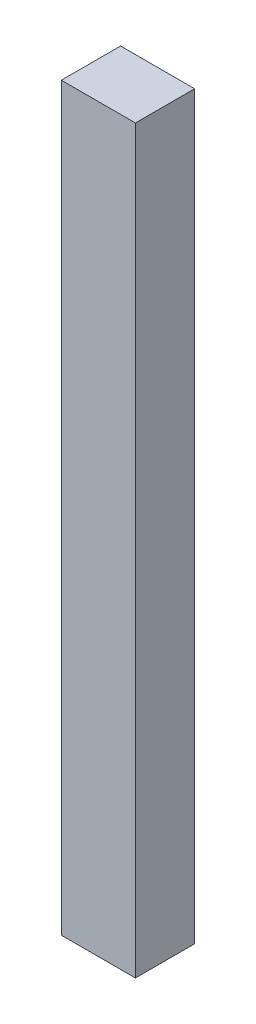
ISO-10303-21;
HEADER;
FILE_DESCRIPTION(('STEP AP214'),'2;1');
FILE_NAME('part.step','',(''),(''),'','','');
FILE_SCHEMA(('AUTOMOTIVE_DESIGN { 1 0 10303 214 1 1 1 1 }'));
ENDSEC;
DATA;
#1=APPLICATION_CONTEXT('core data for automotive mechanical design processes');
#2=APPLICATION_PROTOCOL_DEFINITION('international standard','automotive_design',2000,#1);
#3=PRODUCT_CONTEXT('',#1,'mechanical');
#4=PRODUCT('Part','Part','',(#3));
#5=PRODUCT_RELATED_PRODUCT_CATEGORY('part','',(#4));
#6=PRODUCT_DEFINITION_FORMATION('','',#4);
#7=PRODUCT_DEFINITION_CONTEXT('part definition',#1,'design');
#8=PRODUCT_DEFINITION('design','',#6,#7);
#9=PRODUCT_DEFINITION_SHAPE('','',#8);
#10=(LENGTH_UNIT() NAMED_UNIT(*) SI_UNIT(.MILLI.,.METRE.));
#11=(NAMED_UNIT(*) PLANE_ANGLE_UNIT() SI_UNIT($,.RADIAN.));
#12=(NAMED_UNIT(*) SI_UNIT($,.STERADIAN.) SOLID_ANGLE_UNIT());
#13=UNCERTAINTY_MEASURE_WITH_UNIT(LENGTH_MEASURE(1.E-05),#10,'distance_accuracy_value','');
#14=(GEOMETRIC_REPRESENTATION_CONTEXT(3) GLOBAL_UNCERTAINTY_ASSIGNED_CONTEXT((#13)) GLOBAL_UNIT_ASSIGNED_CONTEXT((#10,
#11,#12)) REPRESENTATION_CONTEXT('',''));
#15=CARTESIAN_POINT('',(0.,0.,0.));
#16=DIRECTION('',(0.,0.,1.));
#17=DIRECTION('',(1.,0.,0.));
#18=AXIS2_PLACEMENT_3D('',#15,#16,#17);
#19=CARTESIAN_POINT('',(12.7,127.,0.));
#20=DIRECTION('',(0.,0.,-1.));
#21=DIRECTION('',(-1.,0.,0.));
#22=AXIS2_PLACEMENT_3D('',#19,#20,#21);
#23=PLANE('',#22);
#24=DIRECTION('',(1.,0.,0.));
#25=VECTOR('',#24,1.);
#26=CARTESIAN_POINT('',(12.7,0.,0.));
#27=LINE('',#26,#25);
#28=CARTESIAN_POINT('',(0.,0.,0.));
#29=VERTEX_POINT('',#28);
#30=CARTESIAN_POINT('',(12.7,0.,0.));
#31=VERTEX_POINT('',#30);
#32=EDGE_CURVE('E96',#29,#31,#27,.T.);
#33=ORIENTED_EDGE('',*,*,#32,.T.);
#34=DIRECTION('',(0.,-1.,0.));
#35=VECTOR('',#34,1.);
#36=CARTESIAN_POINT('',(12.7,127.,0.));
#37=LINE('',#36,#35);
#38=CARTESIAN_POINT('',(12.7,127.,0.));
#39=VERTEX_POINT('',#38);
#40=EDGE_CURVE('E11',#39,#31,#37,.T.);
#41=ORIENTED_EDGE('',*,*,#40,.F.);
#42=DIRECTION('',(1.,0.,0.));
#43=VECTOR('',#42,1.);
#44=CARTESIAN_POINT('',(12.7,127.,0.));
#45=LINE('',#44,#43);
#46=CARTESIAN_POINT('',(0.,127.,0.));
#47=VERTEX_POINT('',#46);
#48=EDGE_CURVE('E84',#47,#39,#45,.T.);
#49=ORIENTED_EDGE('',*,*,#48,.F.);
#50=DIRECTION('',(0.,-1.,0.));
#51=VECTOR('',#50,1.);
#52=CARTESIAN_POINT('',(0.,127.,0.));
#53=LINE('',#52,#51);
#54=EDGE_CURVE('E92',#47,#29,#53,.T.);
#55=ORIENTED_EDGE('',*,*,#54,.T.);
#56=EDGE_LOOP('',(#33,#41,#49,#55));
#57=FACE_BOUND('',#56,.T.);
#58=ADVANCED_FACE('F33',(#57),#23,.F.);
#59=CARTESIAN_POINT('',(12.7,127.,-10.16));
#60=DIRECTION('',(-1.,0.,0.));
#61=DIRECTION('',(0.,0.,1.));
#62=AXIS2_PLACEMENT_3D('',#59,#60,#61);
#63=PLANE('',#62);
#64=DIRECTION('',(0.,0.,-1.));
#65=VECTOR('',#64,1.);
#66=CARTESIAN_POINT('',(12.7,0.,-10.16));
#67=LINE('',#66,#65);
#68=CARTESIAN_POINT('',(12.7,0.,-10.16));
#69=VERTEX_POINT('',#68);
#70=EDGE_CURVE('E88',#31,#69,#67,.T.);
#71=ORIENTED_EDGE('',*,*,#70,.T.);
#72=DIRECTION('',(0.,-1.,0.));
#73=VECTOR('',#72,1.);
#74=CARTESIAN_POINT('',(12.7,127.,-10.16));
#75=LINE('',#74,#73);
#76=CARTESIAN_POINT('',(12.7,127.,-10.16));
#77=VERTEX_POINT('',#76);
#78=EDGE_CURVE('E41',#77,#69,#75,.T.);
#79=ORIENTED_EDGE('',*,*,#78,.F.);
#80=DIRECTION('',(0.,0.,-1.));
#81=VECTOR('',#80,1.);
#82=CARTESIAN_POINT('',(12.7,127.,-10.16));
#83=LINE('',#82,#81);
#84=EDGE_CURVE('E79',#39,#77,#83,.T.);
#85=ORIENTED_EDGE('',*,*,#84,.F.);
#86=ORIENTED_EDGE('',*,*,#40,.T.);
#87=EDGE_LOOP('',(#71,#79,#85,#86));
#88=FACE_BOUND('',#87,.T.);
#89=ADVANCED_FACE('F87',(#88),#63,.F.);
#90=CARTESIAN_POINT('',(0.,127.,-10.16));
#91=DIRECTION('',(0.,0.,1.));
#92=DIRECTION('',(1.,0.,0.));
#93=AXIS2_PLACEMENT_3D('',#90,#91,#92);
#94=PLANE('',#93);
#95=DIRECTION('',(-1.,0.,0.));
#96=VECTOR('',#95,1.);
#97=CARTESIAN_POINT('',(0.,0.,-10.16));
#98=LINE('',#97,#96);
#99=CARTESIAN_POINT('',(0.,0.,-10.16));
#100=VERTEX_POINT('',#99);
#101=EDGE_CURVE('E66',#69,#100,#98,.T.);
#102=ORIENTED_EDGE('',*,*,#101,.T.);
#103=DIRECTION('',(0.,-1.,0.));
#104=VECTOR('',#103,1.);
#105=CARTESIAN_POINT('',(0.,127.,-10.16));
#106=LINE('',#105,#104);
#107=CARTESIAN_POINT('',(0.,127.,-10.16));
#108=VERTEX_POINT('',#107);
#109=EDGE_CURVE('E89',#108,#100,#106,.T.);
#110=ORIENTED_EDGE('',*,*,#109,.F.);
#111=DIRECTION('',(-1.,0.,0.));
#112=VECTOR('',#111,1.);
#113=CARTESIAN_POINT('',(0.,127.,-10.16));
#114=LINE('',#113,#112);
#115=EDGE_CURVE('E82',#77,#108,#114,.T.);
#116=ORIENTED_EDGE('',*,*,#115,.F.);
#117=ORIENTED_EDGE('',*,*,#78,.T.);
#118=EDGE_LOOP('',(#102,#110,#116,#117));
#119=FACE_BOUND('',#118,.T.);
#120=ADVANCED_FACE('F90',(#119),#94,.F.);
#121=CARTESIAN_POINT('',(0.,127.,0.));
#122=DIRECTION('',(1.,0.,0.));
#123=DIRECTION('',(0.,0.,-1.));
#124=AXIS2_PLACEMENT_3D('',#121,#122,#123);
#125=PLANE('',#124);
#126=DIRECTION('',(0.,0.,1.));
#127=VECTOR('',#126,1.);
#128=CARTESIAN_POINT('',(0.,0.,0.));
#129=LINE('',#128,#127);
#130=EDGE_CURVE('E72',#100,#29,#129,.T.);
#131=ORIENTED_EDGE('',*,*,#130,.T.);
#132=ORIENTED_EDGE('',*,*,#54,.F.);
#133=DIRECTION('',(0.,0.,1.));
#134=VECTOR('',#133,1.);
#135=CARTESIAN_POINT('',(0.,127.,0.));
#136=LINE('',#135,#134);
#137=EDGE_CURVE('E49',#108,#47,#136,.T.);
#138=ORIENTED_EDGE('',*,*,#137,.F.);
#139=ORIENTED_EDGE('',*,*,#109,.T.);
#140=EDGE_LOOP('',(#131,#132,#138,#139));
#141=FACE_BOUND('',#140,.T.);
#142=ADVANCED_FACE('F103',(#141),#125,.F.);
#143=CARTESIAN_POINT('',(0.,127.,0.));
#144=DIRECTION('',(0.,-1.,0.));
#145=DIRECTION('',(0.,0.,-1.));
#146=AXIS2_PLACEMENT_3D('',#143,#144,#145);
#147=PLANE('',#146);
#148=ORIENTED_EDGE('',*,*,#48,.T.);
#149=ORIENTED_EDGE('',*,*,#84,.T.);
#150=ORIENTED_EDGE('',*,*,#115,.T.);
#151=ORIENTED_EDGE('',*,*,#137,.T.);
#152=EDGE_LOOP('',(#148,#149,#150,#151));
#153=FACE_BOUND('',#152,.T.);
#154=ADVANCED_FACE('F80',(#153),#147,.F.);
#155=CARTESIAN_POINT('',(0.,0.,0.));
#156=DIRECTION('',(0.,-1.,0.));
#157=DIRECTION('',(0.,0.,-1.));
#158=AXIS2_PLACEMENT_3D('',#155,#156,#157);
#159=PLANE('',#158);
#160=ORIENTED_EDGE('',*,*,#32,.F.);
#161=ORIENTED_EDGE('',*,*,#130,.F.);
#162=ORIENTED_EDGE('',*,*,#101,.F.);
#163=ORIENTED_EDGE('',*,*,#70,.F.);
#164=EDGE_LOOP('',(#160,#161,#162,#163));
#165=FACE_BOUND('',#164,.T.);
#166=ADVANCED_FACE('F106',(#165),#159,.T.);
#167=CLOSED_SHELL('',(#58,#89,#120,#142,#154,#166));
#168=MANIFOLD_SOLID_BREP('B2',#167);
#169=ADVANCED_BREP_SHAPE_REPRESENTATION('',(#18,#168),#14);
#170=SHAPE_DEFINITION_REPRESENTATION(#9,#169);
ENDSEC;
END-ISO-10303-21;
